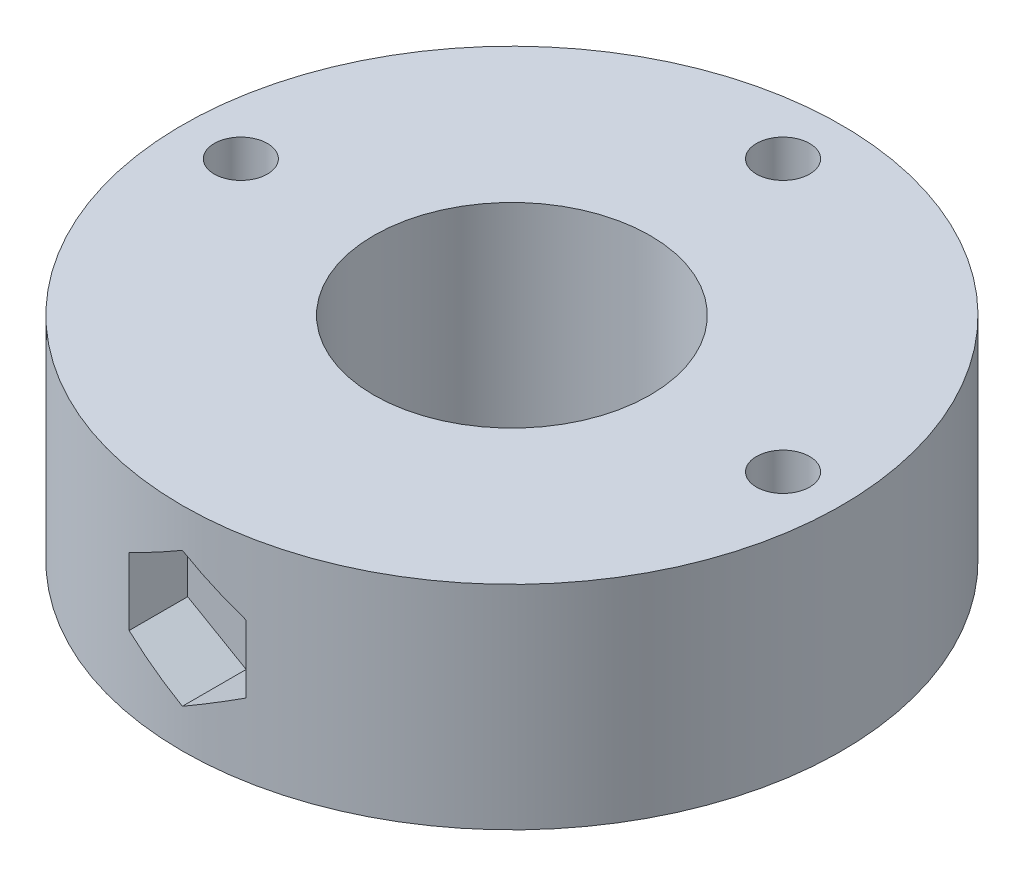
ISO-10303-21;
HEADER;
FILE_DESCRIPTION(('STEP AP214'),'2;1');
FILE_NAME('part.step','',(''),(''),'','','');
FILE_SCHEMA(('AUTOMOTIVE_DESIGN { 1 0 10303 214 1 1 1 1 }'));
ENDSEC;
DATA;
#1=APPLICATION_CONTEXT('core data for automotive mechanical design processes');
#2=APPLICATION_PROTOCOL_DEFINITION('international standard','automotive_design',2000,#1);
#3=PRODUCT_CONTEXT('',#1,'mechanical');
#4=PRODUCT('Part','Part','',(#3));
#5=PRODUCT_RELATED_PRODUCT_CATEGORY('part','',(#4));
#6=PRODUCT_DEFINITION_FORMATION('','',#4);
#7=PRODUCT_DEFINITION_CONTEXT('part definition',#1,'design');
#8=PRODUCT_DEFINITION('design','',#6,#7);
#9=PRODUCT_DEFINITION_SHAPE('','',#8);
#10=(LENGTH_UNIT() NAMED_UNIT(*) SI_UNIT(.MILLI.,.METRE.));
#11=(NAMED_UNIT(*) PLANE_ANGLE_UNIT() SI_UNIT($,.RADIAN.));
#12=(NAMED_UNIT(*) SI_UNIT($,.STERADIAN.) SOLID_ANGLE_UNIT());
#13=UNCERTAINTY_MEASURE_WITH_UNIT(LENGTH_MEASURE(1.E-05),#10,'distance_accuracy_value','');
#14=(GEOMETRIC_REPRESENTATION_CONTEXT(3) GLOBAL_UNCERTAINTY_ASSIGNED_CONTEXT((#13)) GLOBAL_UNIT_ASSIGNED_CONTEXT((#10,
#11,#12)) REPRESENTATION_CONTEXT('',''));
#15=CARTESIAN_POINT('',(0.,0.,0.));
#16=DIRECTION('',(0.,0.,1.));
#17=DIRECTION('',(1.,0.,0.));
#18=AXIS2_PLACEMENT_3D('',#15,#16,#17);
#19=CARTESIAN_POINT('',(0.,20.,0.));
#20=DIRECTION('',(0.,1.,0.));
#21=DIRECTION('',(0.,0.,1.));
#22=AXIS2_PLACEMENT_3D('',#19,#20,#21);
#23=PLANE('',#22);
#24=CARTESIAN_POINT('',(-25.5,20.,0.));
#25=DIRECTION('',(0.,1.,0.));
#26=DIRECTION('',(0.,0.,1.));
#27=AXIS2_PLACEMENT_3D('',#24,#25,#26);
#28=CIRCLE('',#27,2.5);
#29=CARTESIAN_POINT('',(-25.5,20.,2.5));
#30=VERTEX_POINT('',#29);
#31=EDGE_CURVE('E133',#30,#30,#28,.T.);
#32=ORIENTED_EDGE('',*,*,#31,.F.);
#33=EDGE_LOOP('',(#32));
#34=FACE_BOUND('',#33,.T.);
#35=CARTESIAN_POINT('',(0.,20.,0.));
#36=DIRECTION('',(0.,1.,0.));
#37=DIRECTION('',(0.,0.,1.));
#38=AXIS2_PLACEMENT_3D('',#35,#36,#37);
#39=CIRCLE('',#38,13.);
#40=CARTESIAN_POINT('',(0.,20.,13.));
#41=VERTEX_POINT('',#40);
#42=EDGE_CURVE('E145',#41,#41,#39,.T.);
#43=ORIENTED_EDGE('',*,*,#42,.F.);
#44=EDGE_LOOP('',(#43));
#45=FACE_BOUND('',#44,.T.);
#46=CARTESIAN_POINT('',(0.,20.,0.));
#47=DIRECTION('',(0.,1.,0.));
#48=DIRECTION('',(0.,0.,1.));
#49=AXIS2_PLACEMENT_3D('',#46,#47,#48);
#50=CIRCLE('',#49,31.);
#51=CARTESIAN_POINT('',(0.,20.,31.));
#52=VERTEX_POINT('',#51);
#53=EDGE_CURVE('E151',#52,#52,#50,.T.);
#54=ORIENTED_EDGE('',*,*,#53,.T.);
#55=EDGE_LOOP('',(#54));
#56=FACE_BOUND('',#55,.T.);
#57=CARTESIAN_POINT('',(0.,20.,-25.5));
#58=DIRECTION('',(0.,1.,0.));
#59=DIRECTION('',(0.,0.,1.));
#60=AXIS2_PLACEMENT_3D('',#57,#58,#59);
#61=CIRCLE('',#60,2.5);
#62=CARTESIAN_POINT('',(0.,20.,-23.));
#63=VERTEX_POINT('',#62);
#64=EDGE_CURVE('E139',#63,#63,#61,.T.);
#65=ORIENTED_EDGE('',*,*,#64,.F.);
#66=EDGE_LOOP('',(#65));
#67=FACE_BOUND('',#66,.T.);
#68=CARTESIAN_POINT('',(25.5,20.,0.));
#69=DIRECTION('',(0.,1.,0.));
#70=DIRECTION('',(0.,0.,1.));
#71=AXIS2_PLACEMENT_3D('',#68,#69,#70);
#72=CIRCLE('',#71,2.5);
#73=CARTESIAN_POINT('',(25.5,20.,2.5));
#74=VERTEX_POINT('',#73);
#75=EDGE_CURVE('E127',#74,#74,#72,.T.);
#76=ORIENTED_EDGE('',*,*,#75,.F.);
#77=EDGE_LOOP('',(#76));
#78=FACE_BOUND('',#77,.T.);
#79=ADVANCED_FACE('F34',(#34,#45,#56,#67,#78),#23,.T.);
#80=CARTESIAN_POINT('',(0.,0.,0.));
#81=DIRECTION('',(0.,1.,0.));
#82=DIRECTION('',(0.,0.,1.));
#83=AXIS2_PLACEMENT_3D('',#80,#81,#82);
#84=PLANE('',#83);
#85=CARTESIAN_POINT('',(0.,0.,0.));
#86=DIRECTION('',(0.,1.,0.));
#87=DIRECTION('',(0.,0.,1.));
#88=AXIS2_PLACEMENT_3D('',#85,#86,#87);
#89=CIRCLE('',#88,31.);
#90=CARTESIAN_POINT('',(0.,0.,31.));
#91=VERTEX_POINT('',#90);
#92=EDGE_CURVE('E148',#91,#91,#89,.T.);
#93=ORIENTED_EDGE('',*,*,#92,.F.);
#94=EDGE_LOOP('',(#93));
#95=FACE_BOUND('',#94,.T.);
#96=CARTESIAN_POINT('',(0.,0.,0.));
#97=DIRECTION('',(0.,1.,0.));
#98=DIRECTION('',(0.,0.,1.));
#99=AXIS2_PLACEMENT_3D('',#96,#97,#98);
#100=CIRCLE('',#99,13.);
#101=CARTESIAN_POINT('',(0.,0.,13.));
#102=VERTEX_POINT('',#101);
#103=EDGE_CURVE('E142',#102,#102,#100,.T.);
#104=ORIENTED_EDGE('',*,*,#103,.T.);
#105=EDGE_LOOP('',(#104));
#106=FACE_BOUND('',#105,.T.);
#107=CARTESIAN_POINT('',(0.,0.,-25.5));
#108=DIRECTION('',(0.,1.,0.));
#109=DIRECTION('',(0.,0.,1.));
#110=AXIS2_PLACEMENT_3D('',#107,#108,#109);
#111=CIRCLE('',#110,2.5);
#112=CARTESIAN_POINT('',(0.,0.,-23.));
#113=VERTEX_POINT('',#112);
#114=EDGE_CURVE('E136',#113,#113,#111,.T.);
#115=ORIENTED_EDGE('',*,*,#114,.T.);
#116=EDGE_LOOP('',(#115));
#117=FACE_BOUND('',#116,.T.);
#118=CARTESIAN_POINT('',(-25.5,0.,0.));
#119=DIRECTION('',(0.,1.,0.));
#120=DIRECTION('',(0.,0.,1.));
#121=AXIS2_PLACEMENT_3D('',#118,#119,#120);
#122=CIRCLE('',#121,2.5);
#123=CARTESIAN_POINT('',(-25.5,0.,2.5));
#124=VERTEX_POINT('',#123);
#125=EDGE_CURVE('E130',#124,#124,#122,.T.);
#126=ORIENTED_EDGE('',*,*,#125,.T.);
#127=EDGE_LOOP('',(#126));
#128=FACE_BOUND('',#127,.T.);
#129=CARTESIAN_POINT('',(25.5,0.,0.));
#130=DIRECTION('',(0.,1.,0.));
#131=DIRECTION('',(0.,0.,1.));
#132=AXIS2_PLACEMENT_3D('',#129,#130,#131);
#133=CIRCLE('',#132,2.5);
#134=CARTESIAN_POINT('',(25.5,0.,2.5));
#135=VERTEX_POINT('',#134);
#136=EDGE_CURVE('E117',#135,#135,#133,.T.);
#137=ORIENTED_EDGE('',*,*,#136,.T.);
#138=EDGE_LOOP('',(#137));
#139=FACE_BOUND('',#138,.T.);
#140=ADVANCED_FACE('F188',(#95,#106,#117,#128,#139),#84,.F.);
#141=CARTESIAN_POINT('',(0.,20.,0.));
#142=DIRECTION('',(0.,-1.,0.));
#143=DIRECTION('',(0.,0.,-1.));
#144=AXIS2_PLACEMENT_3D('',#141,#142,#143);
#145=CYLINDRICAL_SURFACE('',#144,31.);
#146=CARTESIAN_POINT('',(0.,3.64914703891411,0.));
#147=DIRECTION('',(-0.5,-0.866025403784439,0.));
#148=DIRECTION('',(0.866025403784439,-0.5,0.));
#149=AXIS2_PLACEMENT_3D('',#146,#147,#148);
#150=ELLIPSE('',#149,35.7957166897568,31.);
#151=CARTESIAN_POINT('',(0.,3.64914703891412,31.));
#152=VERTEX_POINT('',#151);
#153=CARTESIAN_POINT('',(-5.5,6.82457351945706,30.5081956201936));
#154=VERTEX_POINT('',#153);
#155=EDGE_CURVE('E154',#152,#154,#150,.T.);
#156=ORIENTED_EDGE('',*,*,#155,.T.);
#157=DIRECTION('',(0.,-1.,0.));
#158=VECTOR('',#157,1.);
#159=CARTESIAN_POINT('',(-5.5,20.,30.5081956201936));
#160=LINE('',#159,#158);
#161=CARTESIAN_POINT('',(-5.5,13.1754264805429,30.5081956201936));
#162=VERTEX_POINT('',#161);
#163=EDGE_CURVE('E11',#154,#162,#160,.F.);
#164=ORIENTED_EDGE('',*,*,#163,.T.);
#165=CARTESIAN_POINT('',(0.,16.3508529610859,0.));
#166=DIRECTION('',(-0.5,0.866025403784439,0.));
#167=DIRECTION('',(-0.866025403784439,-0.5,0.));
#168=AXIS2_PLACEMENT_3D('',#165,#166,#167);
#169=ELLIPSE('',#168,35.7957166897568,31.);
#170=CARTESIAN_POINT('',(0.,16.3508529610859,31.));
#171=VERTEX_POINT('',#170);
#172=EDGE_CURVE('E42',#162,#171,#169,.T.);
#173=ORIENTED_EDGE('',*,*,#172,.T.);
#174=CARTESIAN_POINT('',(0.,16.3508529610859,0.));
#175=DIRECTION('',(0.5,0.866025403784439,0.));
#176=DIRECTION('',(0.866025403784439,-0.5,0.));
#177=AXIS2_PLACEMENT_3D('',#174,#175,#176);
#178=ELLIPSE('',#177,35.7957166897568,31.);
#179=CARTESIAN_POINT('',(5.5,13.1754264805429,30.5081956201936));
#180=VERTEX_POINT('',#179);
#181=EDGE_CURVE('E164',#171,#180,#178,.T.);
#182=ORIENTED_EDGE('',*,*,#181,.T.);
#183=DIRECTION('',(0.,-1.,0.));
#184=VECTOR('',#183,1.);
#185=CARTESIAN_POINT('',(5.5,20.,30.5081956201936));
#186=LINE('',#185,#184);
#187=CARTESIAN_POINT('',(5.5,6.82457351945706,30.5081956201936));
#188=VERTEX_POINT('',#187);
#189=EDGE_CURVE('E161',#180,#188,#186,.T.);
#190=ORIENTED_EDGE('',*,*,#189,.T.);
#191=CARTESIAN_POINT('',(0.,3.64914703891412,0.));
#192=DIRECTION('',(0.5,-0.866025403784438,0.));
#193=DIRECTION('',(-0.866025403784439,-0.5,0.));
#194=AXIS2_PLACEMENT_3D('',#191,#192,#193);
#195=ELLIPSE('',#194,35.7957166897568,31.);
#196=EDGE_CURVE('E158',#188,#152,#195,.T.);
#197=ORIENTED_EDGE('',*,*,#196,.T.);
#198=EDGE_LOOP('',(#156,#164,#173,#182,#190,#197));
#199=FACE_BOUND('',#198,.T.);
#200=ORIENTED_EDGE('',*,*,#53,.F.);
#201=EDGE_LOOP('',(#200));
#202=FACE_BOUND('',#201,.T.);
#203=ORIENTED_EDGE('',*,*,#92,.T.);
#204=EDGE_LOOP('',(#203));
#205=FACE_BOUND('',#204,.T.);
#206=ADVANCED_FACE('F36',(#199,#202,#205),#145,.T.);
#207=CARTESIAN_POINT('',(0.,20.,0.));
#208=DIRECTION('',(0.,-1.,0.));
#209=DIRECTION('',(0.,0.,-1.));
#210=AXIS2_PLACEMENT_3D('',#207,#208,#209);
#211=CYLINDRICAL_SURFACE('',#210,13.);
#212=ORIENTED_EDGE('',*,*,#42,.T.);
#213=EDGE_LOOP('',(#212));
#214=FACE_BOUND('',#213,.T.);
#215=ORIENTED_EDGE('',*,*,#103,.F.);
#216=EDGE_LOOP('',(#215));
#217=FACE_BOUND('',#216,.T.);
#218=ADVANCED_FACE('F198',(#214,#217),#211,.F.);
#219=CARTESIAN_POINT('',(0.,20.,-25.5));
#220=DIRECTION('',(0.,-1.,0.));
#221=DIRECTION('',(0.,0.,-1.));
#222=AXIS2_PLACEMENT_3D('',#219,#220,#221);
#223=CYLINDRICAL_SURFACE('',#222,2.5);
#224=ORIENTED_EDGE('',*,*,#64,.T.);
#225=EDGE_LOOP('',(#224));
#226=FACE_BOUND('',#225,.T.);
#227=ORIENTED_EDGE('',*,*,#114,.F.);
#228=EDGE_LOOP('',(#227));
#229=FACE_BOUND('',#228,.T.);
#230=ADVANCED_FACE('F201',(#226,#229),#223,.F.);
#231=CARTESIAN_POINT('',(-25.5,20.,0.));
#232=DIRECTION('',(0.,-1.,0.));
#233=DIRECTION('',(0.,0.,-1.));
#234=AXIS2_PLACEMENT_3D('',#231,#232,#233);
#235=CYLINDRICAL_SURFACE('',#234,2.5);
#236=ORIENTED_EDGE('',*,*,#31,.T.);
#237=EDGE_LOOP('',(#236));
#238=FACE_BOUND('',#237,.T.);
#239=ORIENTED_EDGE('',*,*,#125,.F.);
#240=EDGE_LOOP('',(#239));
#241=FACE_BOUND('',#240,.T.);
#242=ADVANCED_FACE('F205',(#238,#241),#235,.F.);
#243=CARTESIAN_POINT('',(25.5,20.,0.));
#244=DIRECTION('',(0.,-1.,0.));
#245=DIRECTION('',(0.,0.,-1.));
#246=AXIS2_PLACEMENT_3D('',#243,#244,#245);
#247=CYLINDRICAL_SURFACE('',#246,2.5);
#248=ORIENTED_EDGE('',*,*,#75,.T.);
#249=EDGE_LOOP('',(#248));
#250=FACE_BOUND('',#249,.T.);
#251=ORIENTED_EDGE('',*,*,#136,.F.);
#252=EDGE_LOOP('',(#251));
#253=FACE_BOUND('',#252,.T.);
#254=ADVANCED_FACE('F184',(#250,#253),#247,.F.);
#255=CARTESIAN_POINT('',(-5.5,13.1754264805429,25.));
#256=DIRECTION('',(-1.,0.,0.));
#257=DIRECTION('',(0.,0.,1.));
#258=AXIS2_PLACEMENT_3D('',#255,#256,#257);
#259=PLANE('',#258);
#260=DIRECTION('',(0.,0.,1.));
#261=VECTOR('',#260,1.);
#262=CARTESIAN_POINT('',(-5.5,6.82457351945706,25.));
#263=LINE('',#262,#261);
#264=CARTESIAN_POINT('',(-5.5,6.82457351945706,25.));
#265=VERTEX_POINT('',#264);
#266=EDGE_CURVE('E49',#265,#154,#263,.T.);
#267=ORIENTED_EDGE('',*,*,#266,.F.);
#268=DIRECTION('',(0.,-1.,0.));
#269=VECTOR('',#268,1.);
#270=CARTESIAN_POINT('',(-5.5,13.1754264805429,25.));
#271=LINE('',#270,#269);
#272=CARTESIAN_POINT('',(-5.5,13.1754264805429,25.));
#273=VERTEX_POINT('',#272);
#274=EDGE_CURVE('E88',#273,#265,#271,.T.);
#275=ORIENTED_EDGE('',*,*,#274,.F.);
#276=DIRECTION('',(0.,0.,1.));
#277=VECTOR('',#276,1.);
#278=CARTESIAN_POINT('',(-5.5,13.1754264805429,25.));
#279=LINE('',#278,#277);
#280=EDGE_CURVE('E115',#273,#162,#279,.T.);
#281=ORIENTED_EDGE('',*,*,#280,.T.);
#282=ORIENTED_EDGE('',*,*,#163,.F.);
#283=EDGE_LOOP('',(#267,#275,#281,#282));
#284=FACE_BOUND('',#283,.T.);
#285=ADVANCED_FACE('F86',(#284),#259,.F.);
#286=CARTESIAN_POINT('',(0.,16.3508529610859,25.));
#287=DIRECTION('',(-0.5,0.866025403784439,0.));
#288=DIRECTION('',(-0.866025403784439,-0.5,0.));
#289=AXIS2_PLACEMENT_3D('',#286,#287,#288);
#290=PLANE('',#289);
#291=ORIENTED_EDGE('',*,*,#280,.F.);
#292=DIRECTION('',(-0.866025403784439,-0.5,0.));
#293=VECTOR('',#292,1.);
#294=CARTESIAN_POINT('',(0.,16.3508529610859,25.));
#295=LINE('',#294,#293);
#296=CARTESIAN_POINT('',(0.,16.3508529610859,25.));
#297=VERTEX_POINT('',#296);
#298=EDGE_CURVE('E92',#297,#273,#295,.T.);
#299=ORIENTED_EDGE('',*,*,#298,.F.);
#300=DIRECTION('',(0.,0.,1.));
#301=VECTOR('',#300,1.);
#302=CARTESIAN_POINT('',(0.,16.3508529610859,25.));
#303=LINE('',#302,#301);
#304=EDGE_CURVE('E118',#297,#171,#303,.T.);
#305=ORIENTED_EDGE('',*,*,#304,.T.);
#306=ORIENTED_EDGE('',*,*,#172,.F.);
#307=EDGE_LOOP('',(#291,#299,#305,#306));
#308=FACE_BOUND('',#307,.T.);
#309=ADVANCED_FACE('F176',(#308),#290,.F.);
#310=CARTESIAN_POINT('',(5.5,13.1754264805429,25.));
#311=DIRECTION('',(0.5,0.866025403784439,0.));
#312=DIRECTION('',(-0.866025403784439,0.5,0.));
#313=AXIS2_PLACEMENT_3D('',#310,#311,#312);
#314=PLANE('',#313);
#315=ORIENTED_EDGE('',*,*,#304,.F.);
#316=DIRECTION('',(-0.866025403784439,0.5,0.));
#317=VECTOR('',#316,1.);
#318=CARTESIAN_POINT('',(5.5,13.1754264805429,25.));
#319=LINE('',#318,#317);
#320=CARTESIAN_POINT('',(5.5,13.1754264805429,25.));
#321=VERTEX_POINT('',#320);
#322=EDGE_CURVE('E112',#321,#297,#319,.T.);
#323=ORIENTED_EDGE('',*,*,#322,.F.);
#324=DIRECTION('',(0.,0.,1.));
#325=VECTOR('',#324,1.);
#326=CARTESIAN_POINT('',(5.5,13.1754264805429,25.));
#327=LINE('',#326,#325);
#328=EDGE_CURVE('E120',#321,#180,#327,.T.);
#329=ORIENTED_EDGE('',*,*,#328,.T.);
#330=ORIENTED_EDGE('',*,*,#181,.F.);
#331=EDGE_LOOP('',(#315,#323,#329,#330));
#332=FACE_BOUND('',#331,.T.);
#333=ADVANCED_FACE('F175',(#332),#314,.F.);
#334=CARTESIAN_POINT('',(5.5,6.82457351945706,25.));
#335=DIRECTION('',(1.,0.,0.));
#336=DIRECTION('',(0.,0.,-1.));
#337=AXIS2_PLACEMENT_3D('',#334,#335,#336);
#338=PLANE('',#337);
#339=ORIENTED_EDGE('',*,*,#328,.F.);
#340=DIRECTION('',(0.,1.,0.));
#341=VECTOR('',#340,1.);
#342=CARTESIAN_POINT('',(5.5,6.82457351945706,25.));
#343=LINE('',#342,#341);
#344=CARTESIAN_POINT('',(5.5,6.82457351945706,25.));
#345=VERTEX_POINT('',#344);
#346=EDGE_CURVE('E109',#345,#321,#343,.T.);
#347=ORIENTED_EDGE('',*,*,#346,.F.);
#348=DIRECTION('',(0.,0.,1.));
#349=VECTOR('',#348,1.);
#350=CARTESIAN_POINT('',(5.5,6.82457351945706,25.));
#351=LINE('',#350,#349);
#352=EDGE_CURVE('E123',#345,#188,#351,.T.);
#353=ORIENTED_EDGE('',*,*,#352,.T.);
#354=ORIENTED_EDGE('',*,*,#189,.F.);
#355=EDGE_LOOP('',(#339,#347,#353,#354));
#356=FACE_BOUND('',#355,.T.);
#357=ADVANCED_FACE('F173',(#356),#338,.F.);
#358=CARTESIAN_POINT('',(0.,3.64914703891412,25.));
#359=DIRECTION('',(0.5,-0.866025403784438,0.));
#360=DIRECTION('',(0.866025403784439,0.5,0.));
#361=AXIS2_PLACEMENT_3D('',#358,#359,#360);
#362=PLANE('',#361);
#363=ORIENTED_EDGE('',*,*,#352,.F.);
#364=DIRECTION('',(0.866025403784439,0.5,0.));
#365=VECTOR('',#364,1.);
#366=CARTESIAN_POINT('',(0.,3.64914703891412,25.));
#367=LINE('',#366,#365);
#368=CARTESIAN_POINT('',(0.,3.64914703891412,25.));
#369=VERTEX_POINT('',#368);
#370=EDGE_CURVE('E101',#369,#345,#367,.T.);
#371=ORIENTED_EDGE('',*,*,#370,.F.);
#372=DIRECTION('',(0.,0.,1.));
#373=VECTOR('',#372,1.);
#374=CARTESIAN_POINT('',(0.,3.64914703891412,25.));
#375=LINE('',#374,#373);
#376=EDGE_CURVE('E91',#369,#152,#375,.T.);
#377=ORIENTED_EDGE('',*,*,#376,.T.);
#378=ORIENTED_EDGE('',*,*,#196,.F.);
#379=EDGE_LOOP('',(#363,#371,#377,#378));
#380=FACE_BOUND('',#379,.T.);
#381=ADVANCED_FACE('F169',(#380),#362,.F.);
#382=CARTESIAN_POINT('',(-5.5,6.82457351945706,25.));
#383=DIRECTION('',(-0.5,-0.866025403784439,0.));
#384=DIRECTION('',(0.866025403784439,-0.5,0.));
#385=AXIS2_PLACEMENT_3D('',#382,#383,#384);
#386=PLANE('',#385);
#387=ORIENTED_EDGE('',*,*,#376,.F.);
#388=DIRECTION('',(0.866025403784438,-0.5,0.));
#389=VECTOR('',#388,1.);
#390=CARTESIAN_POINT('',(-5.5,6.82457351945706,25.));
#391=LINE('',#390,#389);
#392=EDGE_CURVE('E95',#265,#369,#391,.T.);
#393=ORIENTED_EDGE('',*,*,#392,.F.);
#394=ORIENTED_EDGE('',*,*,#266,.T.);
#395=ORIENTED_EDGE('',*,*,#155,.F.);
#396=EDGE_LOOP('',(#387,#393,#394,#395));
#397=FACE_BOUND('',#396,.T.);
#398=ADVANCED_FACE('F96',(#397),#386,.F.);
#399=CARTESIAN_POINT('',(0.,0.,25.));
#400=DIRECTION('',(0.,0.,1.));
#401=DIRECTION('',(1.,0.,0.));
#402=AXIS2_PLACEMENT_3D('',#399,#400,#401);
#403=PLANE('',#402);
#404=ORIENTED_EDGE('',*,*,#274,.T.);
#405=ORIENTED_EDGE('',*,*,#392,.T.);
#406=ORIENTED_EDGE('',*,*,#370,.T.);
#407=ORIENTED_EDGE('',*,*,#346,.T.);
#408=ORIENTED_EDGE('',*,*,#322,.T.);
#409=ORIENTED_EDGE('',*,*,#298,.T.);
#410=EDGE_LOOP('',(#404,#405,#406,#407,#408,#409));
#411=FACE_BOUND('',#410,.T.);
#412=ADVANCED_FACE('F103',(#411),#403,.T.);
#413=CLOSED_SHELL('',(#79,#140,#206,#218,#230,#242,#254,#285,#309,#333,#357,#381,#398,#412));
#414=MANIFOLD_SOLID_BREP('B2',#413);
#415=ADVANCED_BREP_SHAPE_REPRESENTATION('',(#18,#414),#14);
#416=SHAPE_DEFINITION_REPRESENTATION(#9,#415);
ENDSEC;
END-ISO-10303-21;
